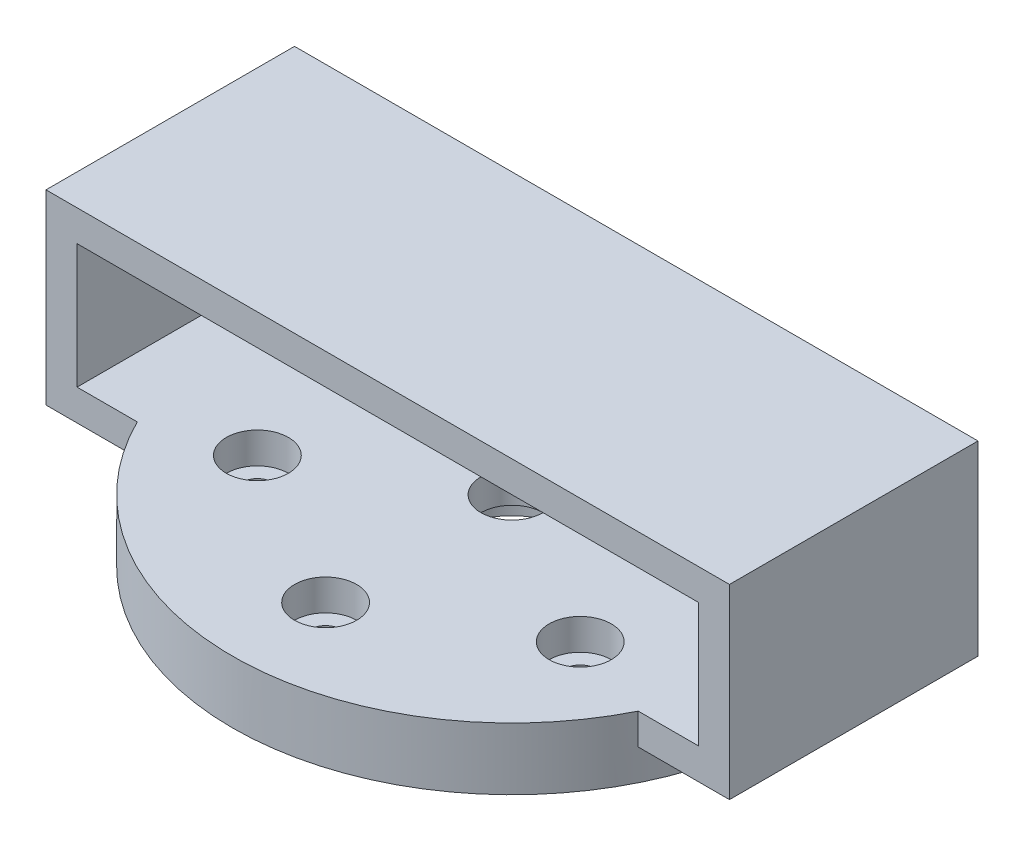
ISO-10303-21;
HEADER;
FILE_DESCRIPTION(('STEP AP214'),'2;1');
FILE_NAME('part.step','',(''),(''),'','','');
FILE_SCHEMA(('AUTOMOTIVE_DESIGN { 1 0 10303 214 1 1 1 1 }'));
ENDSEC;
DATA;
#1=APPLICATION_CONTEXT('core data for automotive mechanical design processes');
#2=APPLICATION_PROTOCOL_DEFINITION('international standard','automotive_design',2000,#1);
#3=PRODUCT_CONTEXT('',#1,'mechanical');
#4=PRODUCT('Part','Part','',(#3));
#5=PRODUCT_RELATED_PRODUCT_CATEGORY('part','',(#4));
#6=PRODUCT_DEFINITION_FORMATION('','',#4);
#7=PRODUCT_DEFINITION_CONTEXT('part definition',#1,'design');
#8=PRODUCT_DEFINITION('design','',#6,#7);
#9=PRODUCT_DEFINITION_SHAPE('','',#8);
#10=(LENGTH_UNIT() NAMED_UNIT(*) SI_UNIT(.MILLI.,.METRE.));
#11=(NAMED_UNIT(*) PLANE_ANGLE_UNIT() SI_UNIT($,.RADIAN.));
#12=(NAMED_UNIT(*) SI_UNIT($,.STERADIAN.) SOLID_ANGLE_UNIT());
#13=UNCERTAINTY_MEASURE_WITH_UNIT(LENGTH_MEASURE(1.E-05),#10,'distance_accuracy_value','');
#14=(GEOMETRIC_REPRESENTATION_CONTEXT(3) GLOBAL_UNCERTAINTY_ASSIGNED_CONTEXT((#13)) GLOBAL_UNIT_ASSIGNED_CONTEXT((#10,
#11,#12)) REPRESENTATION_CONTEXT('',''));
#15=CARTESIAN_POINT('',(0.,0.,0.));
#16=DIRECTION('',(0.,0.,1.));
#17=DIRECTION('',(1.,0.,0.));
#18=AXIS2_PLACEMENT_3D('',#15,#16,#17);
#19=CARTESIAN_POINT('',(0.,10.,-30.));
#20=DIRECTION('',(0.,-1.,0.));
#21=DIRECTION('',(0.,0.,-1.));
#22=AXIS2_PLACEMENT_3D('',#19,#20,#21);
#23=CYLINDRICAL_SURFACE('',#22,2.5);
#24=CARTESIAN_POINT('',(0.,0.,-30.));
#25=DIRECTION('',(0.,1.,0.));
#26=DIRECTION('',(0.,0.,1.));
#27=AXIS2_PLACEMENT_3D('',#24,#25,#26);
#28=CIRCLE('',#27,2.5);
#29=CARTESIAN_POINT('',(0.,0.,-27.5));
#30=VERTEX_POINT('',#29);
#31=EDGE_CURVE('E222',#30,#30,#28,.T.);
#32=ORIENTED_EDGE('',*,*,#31,.F.);
#33=EDGE_LOOP('',(#32));
#34=FACE_BOUND('',#33,.T.);
#35=CARTESIAN_POINT('',(0.,5.,-30.));
#36=DIRECTION('',(0.,1.,0.));
#37=DIRECTION('',(0.,0.,1.));
#38=AXIS2_PLACEMENT_3D('',#35,#36,#37);
#39=CIRCLE('',#38,2.5);
#40=CARTESIAN_POINT('',(0.,5.,-27.5));
#41=VERTEX_POINT('',#40);
#42=EDGE_CURVE('E36',#41,#41,#39,.T.);
#43=ORIENTED_EDGE('',*,*,#42,.T.);
#44=EDGE_LOOP('',(#43));
#45=FACE_BOUND('',#44,.T.);
#46=ADVANCED_FACE('F32',(#34,#45),#23,.F.);
#47=CARTESIAN_POINT('',(3.39958331045615E-12,10.,30.));
#48=DIRECTION('',(0.,-1.,0.));
#49=DIRECTION('',(0.,0.,-1.));
#50=AXIS2_PLACEMENT_3D('',#47,#48,#49);
#51=CYLINDRICAL_SURFACE('',#50,2.50000000000345);
#52=CARTESIAN_POINT('',(3.39958331045615E-12,0.,30.));
#53=DIRECTION('',(0.,1.,0.));
#54=DIRECTION('',(0.,0.,1.));
#55=AXIS2_PLACEMENT_3D('',#52,#53,#54);
#56=CIRCLE('',#55,2.50000000000345);
#57=CARTESIAN_POINT('',(3.39958331045615E-12,0.,32.5000000000035));
#58=VERTEX_POINT('',#57);
#59=EDGE_CURVE('E213',#58,#58,#56,.T.);
#60=ORIENTED_EDGE('',*,*,#59,.F.);
#61=EDGE_LOOP('',(#60));
#62=FACE_BOUND('',#61,.T.);
#63=CARTESIAN_POINT('',(3.39958331045615E-12,5.,30.));
#64=DIRECTION('',(0.,1.,0.));
#65=DIRECTION('',(0.,0.,1.));
#66=AXIS2_PLACEMENT_3D('',#63,#64,#65);
#67=CIRCLE('',#66,2.50000000000345);
#68=CARTESIAN_POINT('',(3.39958331045615E-12,5.,32.5000000000035));
#69=VERTEX_POINT('',#68);
#70=EDGE_CURVE('E248',#69,#69,#67,.T.);
#71=ORIENTED_EDGE('',*,*,#70,.T.);
#72=EDGE_LOOP('',(#71));
#73=FACE_BOUND('',#72,.T.);
#74=ADVANCED_FACE('F317',(#62,#73),#51,.F.);
#75=CARTESIAN_POINT('',(0.,10.,0.));
#76=DIRECTION('',(0.,-1.,0.));
#77=DIRECTION('',(0.,0.,-1.));
#78=AXIS2_PLACEMENT_3D('',#75,#76,#77);
#79=CYLINDRICAL_SURFACE('',#78,10.);
#80=CARTESIAN_POINT('',(0.,0.,0.));
#81=DIRECTION('',(0.,1.,0.));
#82=DIRECTION('',(0.,0.,1.));
#83=AXIS2_PLACEMENT_3D('',#80,#81,#82);
#84=CIRCLE('',#83,10.);
#85=CARTESIAN_POINT('',(0.,0.,10.));
#86=VERTEX_POINT('',#85);
#87=EDGE_CURVE('E225',#86,#86,#84,.T.);
#88=ORIENTED_EDGE('',*,*,#87,.F.);
#89=EDGE_LOOP('',(#88));
#90=FACE_BOUND('',#89,.T.);
#91=CARTESIAN_POINT('',(0.,5.,0.));
#92=DIRECTION('',(0.,1.,0.));
#93=DIRECTION('',(0.,0.,1.));
#94=AXIS2_PLACEMENT_3D('',#91,#92,#93);
#95=CIRCLE('',#94,10.);
#96=CARTESIAN_POINT('',(0.,5.,10.));
#97=VERTEX_POINT('',#96);
#98=EDGE_CURVE('E187',#97,#97,#95,.T.);
#99=ORIENTED_EDGE('',*,*,#98,.T.);
#100=EDGE_LOOP('',(#99));
#101=FACE_BOUND('',#100,.T.);
#102=ADVANCED_FACE('F323',(#90,#101),#79,.F.);
#103=CARTESIAN_POINT('',(25.980762113534,10.,-15.0000000000015));
#104=DIRECTION('',(0.,-1.,0.));
#105=DIRECTION('',(0.,0.,-1.));
#106=AXIS2_PLACEMENT_3D('',#103,#104,#105);
#107=CYLINDRICAL_SURFACE('',#106,2.50000000000046);
#108=CARTESIAN_POINT('',(25.980762113534,0.,-15.0000000000015));
#109=DIRECTION('',(0.,1.,0.));
#110=DIRECTION('',(0.,0.,1.));
#111=AXIS2_PLACEMENT_3D('',#108,#109,#110);
#112=CIRCLE('',#111,2.50000000000046);
#113=CARTESIAN_POINT('',(25.980762113534,0.,-12.500000000001));
#114=VERTEX_POINT('',#113);
#115=EDGE_CURVE('E219',#114,#114,#112,.T.);
#116=ORIENTED_EDGE('',*,*,#115,.F.);
#117=EDGE_LOOP('',(#116));
#118=FACE_BOUND('',#117,.T.);
#119=CARTESIAN_POINT('',(25.980762113534,5.,-15.0000000000015));
#120=DIRECTION('',(0.,1.,0.));
#121=DIRECTION('',(0.,0.,1.));
#122=AXIS2_PLACEMENT_3D('',#119,#120,#121);
#123=CIRCLE('',#122,2.50000000000046);
#124=CARTESIAN_POINT('',(25.980762113534,5.,-12.500000000001));
#125=VERTEX_POINT('',#124);
#126=EDGE_CURVE('E199',#125,#125,#123,.T.);
#127=ORIENTED_EDGE('',*,*,#126,.T.);
#128=EDGE_LOOP('',(#127));
#129=FACE_BOUND('',#128,.T.);
#130=ADVANCED_FACE('F329',(#118,#129),#107,.F.);
#131=CARTESIAN_POINT('',(25.9807621135357,10.,14.9999999999985));
#132=DIRECTION('',(0.,-1.,0.));
#133=DIRECTION('',(0.,0.,-1.));
#134=AXIS2_PLACEMENT_3D('',#131,#132,#133);
#135=CYLINDRICAL_SURFACE('',#134,2.50000000000215);
#136=CARTESIAN_POINT('',(25.9807621135357,0.,14.9999999999985));
#137=DIRECTION('',(0.,1.,0.));
#138=DIRECTION('',(0.,0.,1.));
#139=AXIS2_PLACEMENT_3D('',#136,#137,#138);
#140=CIRCLE('',#139,2.50000000000215);
#141=CARTESIAN_POINT('',(25.9807621135357,0.,17.5000000000007));
#142=VERTEX_POINT('',#141);
#143=EDGE_CURVE('E216',#142,#142,#140,.T.);
#144=ORIENTED_EDGE('',*,*,#143,.F.);
#145=EDGE_LOOP('',(#144));
#146=FACE_BOUND('',#145,.T.);
#147=CARTESIAN_POINT('',(25.9807621135357,5.,14.9999999999985));
#148=DIRECTION('',(0.,1.,0.));
#149=DIRECTION('',(0.,0.,1.));
#150=AXIS2_PLACEMENT_3D('',#147,#148,#149);
#151=CIRCLE('',#150,2.50000000000215);
#152=CARTESIAN_POINT('',(25.9807621135357,5.,17.5000000000007));
#153=VERTEX_POINT('',#152);
#154=EDGE_CURVE('E196',#153,#153,#151,.T.);
#155=ORIENTED_EDGE('',*,*,#154,.T.);
#156=EDGE_LOOP('',(#155));
#157=FACE_BOUND('',#156,.T.);
#158=ADVANCED_FACE('F336',(#146,#157),#135,.F.);
#159=CARTESIAN_POINT('',(-25.9807621135306,10.,15.0000000000015));
#160=DIRECTION('',(0.,-1.,0.));
#161=DIRECTION('',(0.,0.,-1.));
#162=AXIS2_PLACEMENT_3D('',#159,#160,#161);
#163=CYLINDRICAL_SURFACE('',#162,2.50000000000315);
#164=CARTESIAN_POINT('',(-25.9807621135306,0.,15.0000000000015));
#165=DIRECTION('',(0.,1.,0.));
#166=DIRECTION('',(0.,0.,1.));
#167=AXIS2_PLACEMENT_3D('',#164,#165,#166);
#168=CIRCLE('',#167,2.50000000000315);
#169=CARTESIAN_POINT('',(-25.9807621135306,0.,17.5000000000046));
#170=VERTEX_POINT('',#169);
#171=EDGE_CURVE('E210',#170,#170,#168,.T.);
#172=ORIENTED_EDGE('',*,*,#171,.F.);
#173=EDGE_LOOP('',(#172));
#174=FACE_BOUND('',#173,.T.);
#175=CARTESIAN_POINT('',(-25.9807621135306,5.,15.0000000000015));
#176=DIRECTION('',(0.,1.,0.));
#177=DIRECTION('',(0.,0.,1.));
#178=AXIS2_PLACEMENT_3D('',#175,#176,#177);
#179=CIRCLE('',#178,2.50000000000315);
#180=CARTESIAN_POINT('',(-25.9807621135306,5.,17.5000000000046));
#181=VERTEX_POINT('',#180);
#182=EDGE_CURVE('E193',#181,#181,#179,.T.);
#183=ORIENTED_EDGE('',*,*,#182,.T.);
#184=EDGE_LOOP('',(#183));
#185=FACE_BOUND('',#184,.T.);
#186=ADVANCED_FACE('F310',(#174,#185),#163,.F.);
#187=CARTESIAN_POINT('',(-25.9807621135323,10.,-14.9999999999985));
#188=DIRECTION('',(0.,-1.,0.));
#189=DIRECTION('',(0.,0.,-1.));
#190=AXIS2_PLACEMENT_3D('',#187,#188,#189);
#191=CYLINDRICAL_SURFACE('',#190,2.5000000000016);
#192=CARTESIAN_POINT('',(-25.9807621135323,0.,-14.9999999999985));
#193=DIRECTION('',(0.,1.,0.));
#194=DIRECTION('',(0.,0.,1.));
#195=AXIS2_PLACEMENT_3D('',#192,#193,#194);
#196=CIRCLE('',#195,2.5000000000016);
#197=CARTESIAN_POINT('',(-25.9807621135323,0.,-12.4999999999969));
#198=VERTEX_POINT('',#197);
#199=EDGE_CURVE('E207',#198,#198,#196,.T.);
#200=ORIENTED_EDGE('',*,*,#199,.F.);
#201=EDGE_LOOP('',(#200));
#202=FACE_BOUND('',#201,.T.);
#203=CARTESIAN_POINT('',(-25.9807621135323,5.,-14.9999999999985));
#204=DIRECTION('',(0.,1.,0.));
#205=DIRECTION('',(0.,0.,1.));
#206=AXIS2_PLACEMENT_3D('',#203,#204,#205);
#207=CIRCLE('',#206,2.5000000000016);
#208=CARTESIAN_POINT('',(-25.9807621135323,5.,-12.4999999999969));
#209=VERTEX_POINT('',#208);
#210=EDGE_CURVE('E143',#209,#209,#207,.T.);
#211=ORIENTED_EDGE('',*,*,#210,.T.);
#212=EDGE_LOOP('',(#211));
#213=FACE_BOUND('',#212,.T.);
#214=ADVANCED_FACE('F302',(#202,#213),#191,.F.);
#215=CARTESIAN_POINT('',(0.,10.,0.));
#216=DIRECTION('',(0.,1.,0.));
#217=DIRECTION('',(0.,0.,1.));
#218=AXIS2_PLACEMENT_3D('',#215,#216,#217);
#219=PLANE('',#218);
#220=CARTESIAN_POINT('',(0.,10.,-30.));
#221=DIRECTION('',(0.,1.,0.));
#222=DIRECTION('',(0.,0.,1.));
#223=AXIS2_PLACEMENT_3D('',#220,#221,#222);
#224=CIRCLE('',#223,5.);
#225=CARTESIAN_POINT('',(0.,10.,-25.));
#226=VERTEX_POINT('',#225);
#227=EDGE_CURVE('E255',#226,#226,#224,.T.);
#228=ORIENTED_EDGE('',*,*,#227,.F.);
#229=EDGE_LOOP('',(#228));
#230=FACE_BOUND('',#229,.T.);
#231=CARTESIAN_POINT('',(1.69794191727524E-12,10.,0.));
#232=DIRECTION('',(0.,1.,0.));
#233=DIRECTION('',(0.,0.,1.));
#234=AXIS2_PLACEMENT_3D('',#231,#232,#233);
#235=CIRCLE('',#234,5.);
#236=CARTESIAN_POINT('',(1.69794191727524E-12,10.,5.));
#237=VERTEX_POINT('',#236);
#238=EDGE_CURVE('E265',#237,#237,#235,.T.);
#239=ORIENTED_EDGE('',*,*,#238,.F.);
#240=EDGE_LOOP('',(#239));
#241=FACE_BOUND('',#240,.T.);
#242=CARTESIAN_POINT('',(25.980762113534,10.,-15.0000000000015));
#243=DIRECTION('',(0.,1.,0.));
#244=DIRECTION('',(0.,0.,1.));
#245=AXIS2_PLACEMENT_3D('',#242,#243,#244);
#246=CIRCLE('',#245,5.00000000000046);
#247=CARTESIAN_POINT('',(25.980762113534,10.,-10.000000000001));
#248=VERTEX_POINT('',#247);
#249=EDGE_CURVE('E271',#248,#248,#246,.T.);
#250=ORIENTED_EDGE('',*,*,#249,.F.);
#251=EDGE_LOOP('',(#250));
#252=FACE_BOUND('',#251,.T.);
#253=CARTESIAN_POINT('',(25.9807621135357,10.,14.9999999999985));
#254=DIRECTION('',(0.,1.,0.));
#255=DIRECTION('',(0.,0.,1.));
#256=AXIS2_PLACEMENT_3D('',#253,#254,#255);
#257=CIRCLE('',#256,5.00000000000214);
#258=CARTESIAN_POINT('',(25.9807621135357,10.,20.0000000000007));
#259=VERTEX_POINT('',#258);
#260=EDGE_CURVE('E277',#259,#259,#257,.T.);
#261=ORIENTED_EDGE('',*,*,#260,.F.);
#262=EDGE_LOOP('',(#261));
#263=FACE_BOUND('',#262,.T.);
#264=CARTESIAN_POINT('',(3.39958331045615E-12,10.,30.));
#265=DIRECTION('',(0.,1.,0.));
#266=DIRECTION('',(0.,0.,1.));
#267=AXIS2_PLACEMENT_3D('',#264,#265,#266);
#268=CIRCLE('',#267,5.00000000000345);
#269=CARTESIAN_POINT('',(3.39958331045615E-12,10.,35.0000000000034));
#270=VERTEX_POINT('',#269);
#271=EDGE_CURVE('E283',#270,#270,#268,.T.);
#272=ORIENTED_EDGE('',*,*,#271,.F.);
#273=EDGE_LOOP('',(#272));
#274=FACE_BOUND('',#273,.T.);
#275=CARTESIAN_POINT('',(-25.9807621135306,10.,15.0000000000015));
#276=DIRECTION('',(0.,1.,0.));
#277=DIRECTION('',(0.,0.,1.));
#278=AXIS2_PLACEMENT_3D('',#275,#276,#277);
#279=CIRCLE('',#278,5.00000000000315);
#280=CARTESIAN_POINT('',(-25.9807621135306,10.,20.0000000000046));
#281=VERTEX_POINT('',#280);
#282=EDGE_CURVE('E289',#281,#281,#279,.T.);
#283=ORIENTED_EDGE('',*,*,#282,.F.);
#284=EDGE_LOOP('',(#283));
#285=FACE_BOUND('',#284,.T.);
#286=CARTESIAN_POINT('',(-25.9807621135323,10.,-14.9999999999985));
#287=DIRECTION('',(0.,1.,0.));
#288=DIRECTION('',(0.,0.,1.));
#289=AXIS2_PLACEMENT_3D('',#286,#287,#288);
#290=CIRCLE('',#289,5.0000000000016);
#291=CARTESIAN_POINT('',(-25.9807621135323,10.,-9.99999999999691));
#292=VERTEX_POINT('',#291);
#293=EDGE_CURVE('E294',#292,#292,#290,.T.);
#294=ORIENTED_EDGE('',*,*,#293,.F.);
#295=EDGE_LOOP('',(#294));
#296=FACE_BOUND('',#295,.T.);
#297=CARTESIAN_POINT('',(0.,10.,0.));
#298=DIRECTION('',(0.,1.,0.));
#299=DIRECTION('',(0.,0.,1.));
#300=AXIS2_PLACEMENT_3D('',#297,#298,#299);
#301=CIRCLE('',#300,45.);
#302=CARTESIAN_POINT('',(-40.3112887414927,10.,20.));
#303=VERTEX_POINT('',#302);
#304=CARTESIAN_POINT('',(40.3112887414927,10.,20.));
#305=VERTEX_POINT('',#304);
#306=EDGE_CURVE('E229',#303,#305,#301,.T.);
#307=ORIENTED_EDGE('',*,*,#306,.T.);
#308=DIRECTION('',(1.,0.,0.));
#309=VECTOR('',#308,1.);
#310=CARTESIAN_POINT('',(-55.,10.,20.));
#311=LINE('',#310,#309);
#312=CARTESIAN_POINT('',(50.,10.,20.));
#313=VERTEX_POINT('',#312);
#314=EDGE_CURVE('E43',#305,#313,#311,.T.);
#315=ORIENTED_EDGE('',*,*,#314,.T.);
#316=DIRECTION('',(0.,0.,-1.));
#317=VECTOR('',#316,1.);
#318=CARTESIAN_POINT('',(50.,10.,25.));
#319=LINE('',#318,#317);
#320=CARTESIAN_POINT('',(50.,10.,-20.));
#321=VERTEX_POINT('',#320);
#322=EDGE_CURVE('E122',#313,#321,#319,.T.);
#323=ORIENTED_EDGE('',*,*,#322,.T.);
#324=DIRECTION('',(-1.,0.,0.));
#325=VECTOR('',#324,1.);
#326=CARTESIAN_POINT('',(50.,10.,-20.));
#327=LINE('',#326,#325);
#328=CARTESIAN_POINT('',(40.3112887414927,10.,-20.));
#329=VERTEX_POINT('',#328);
#330=EDGE_CURVE('E127',#321,#329,#327,.T.);
#331=ORIENTED_EDGE('',*,*,#330,.T.);
#332=CARTESIAN_POINT('',(-40.3112887414927,10.,-20.));
#333=VERTEX_POINT('',#332);
#334=EDGE_CURVE('E231',#329,#333,#301,.T.);
#335=ORIENTED_EDGE('',*,*,#334,.T.);
#336=CARTESIAN_POINT('',(-50.,10.,-20.));
#337=VERTEX_POINT('',#336);
#338=EDGE_CURVE('E142',#333,#337,#327,.T.);
#339=ORIENTED_EDGE('',*,*,#338,.T.);
#340=DIRECTION('',(0.,0.,-1.));
#341=VECTOR('',#340,1.);
#342=CARTESIAN_POINT('',(-50.,10.,25.));
#343=LINE('',#342,#341);
#344=CARTESIAN_POINT('',(-50.,10.,20.));
#345=VERTEX_POINT('',#344);
#346=EDGE_CURVE('E131',#345,#337,#343,.T.);
#347=ORIENTED_EDGE('',*,*,#346,.F.);
#348=EDGE_CURVE('E11',#345,#303,#311,.T.);
#349=ORIENTED_EDGE('',*,*,#348,.T.);
#350=EDGE_LOOP('',(#307,#315,#323,#331,#335,#339,#347,#349));
#351=FACE_BOUND('',#350,.T.);
#352=ADVANCED_FACE('F124',(#230,#241,#252,#263,#274,#285,#296,#351),#219,.T.);
#353=CARTESIAN_POINT('',(0.,0.,0.));
#354=DIRECTION('',(0.,1.,0.));
#355=DIRECTION('',(0.,0.,1.));
#356=AXIS2_PLACEMENT_3D('',#353,#354,#355);
#357=PLANE('',#356);
#358=CARTESIAN_POINT('',(0.,0.,0.));
#359=DIRECTION('',(0.,1.,0.));
#360=DIRECTION('',(0.,0.,1.));
#361=AXIS2_PLACEMENT_3D('',#358,#359,#360);
#362=CIRCLE('',#361,45.);
#363=CARTESIAN_POINT('',(0.,0.,45.));
#364=VERTEX_POINT('',#363);
#365=EDGE_CURVE('E228',#364,#364,#362,.T.);
#366=ORIENTED_EDGE('',*,*,#365,.F.);
#367=EDGE_LOOP('',(#366));
#368=FACE_BOUND('',#367,.T.);
#369=ORIENTED_EDGE('',*,*,#87,.T.);
#370=EDGE_LOOP('',(#369));
#371=FACE_BOUND('',#370,.T.);
#372=ORIENTED_EDGE('',*,*,#31,.T.);
#373=EDGE_LOOP('',(#372));
#374=FACE_BOUND('',#373,.T.);
#375=ORIENTED_EDGE('',*,*,#115,.T.);
#376=EDGE_LOOP('',(#375));
#377=FACE_BOUND('',#376,.T.);
#378=ORIENTED_EDGE('',*,*,#143,.T.);
#379=EDGE_LOOP('',(#378));
#380=FACE_BOUND('',#379,.T.);
#381=ORIENTED_EDGE('',*,*,#59,.T.);
#382=EDGE_LOOP('',(#381));
#383=FACE_BOUND('',#382,.T.);
#384=ORIENTED_EDGE('',*,*,#171,.T.);
#385=EDGE_LOOP('',(#384));
#386=FACE_BOUND('',#385,.T.);
#387=ORIENTED_EDGE('',*,*,#199,.T.);
#388=EDGE_LOOP('',(#387));
#389=FACE_BOUND('',#388,.T.);
#390=ADVANCED_FACE('F301',(#368,#371,#374,#377,#380,#383,#386,#389),#357,.F.);
#391=CARTESIAN_POINT('',(0.,10.,0.));
#392=DIRECTION('',(0.,-1.,0.));
#393=DIRECTION('',(0.,0.,-1.));
#394=AXIS2_PLACEMENT_3D('',#391,#392,#393);
#395=CYLINDRICAL_SURFACE('',#394,45.);
#396=ORIENTED_EDGE('',*,*,#334,.F.);
#397=DIRECTION('',(0.,-1.,0.));
#398=VECTOR('',#397,1.);
#399=CARTESIAN_POINT('',(40.3112887414927,10.,-20.));
#400=LINE('',#399,#398);
#401=CARTESIAN_POINT('',(40.3112887414927,5.,-20.));
#402=VERTEX_POINT('',#401);
#403=EDGE_CURVE('E50',#329,#402,#400,.T.);
#404=ORIENTED_EDGE('',*,*,#403,.T.);
#405=CARTESIAN_POINT('',(0.,5.,0.));
#406=DIRECTION('',(0.,1.,0.));
#407=DIRECTION('',(0.,0.,1.));
#408=AXIS2_PLACEMENT_3D('',#405,#406,#407);
#409=CIRCLE('',#408,45.);
#410=CARTESIAN_POINT('',(40.3112887414927,5.,20.));
#411=VERTEX_POINT('',#410);
#412=EDGE_CURVE('E54',#411,#402,#409,.T.);
#413=ORIENTED_EDGE('',*,*,#412,.F.);
#414=DIRECTION('',(0.,-1.,0.));
#415=VECTOR('',#414,1.);
#416=CARTESIAN_POINT('',(40.3112887414927,10.,20.));
#417=LINE('',#416,#415);
#418=EDGE_CURVE('E241',#411,#305,#417,.F.);
#419=ORIENTED_EDGE('',*,*,#418,.T.);
#420=ORIENTED_EDGE('',*,*,#306,.F.);
#421=DIRECTION('',(0.,-1.,0.));
#422=VECTOR('',#421,1.);
#423=CARTESIAN_POINT('',(-40.3112887414927,10.,20.));
#424=LINE('',#423,#422);
#425=CARTESIAN_POINT('',(-40.3112887414927,5.,20.));
#426=VERTEX_POINT('',#425);
#427=EDGE_CURVE('E236',#303,#426,#424,.T.);
#428=ORIENTED_EDGE('',*,*,#427,.T.);
#429=CARTESIAN_POINT('',(-40.3112887414927,5.,-20.));
#430=VERTEX_POINT('',#429);
#431=EDGE_CURVE('E204',#430,#426,#409,.T.);
#432=ORIENTED_EDGE('',*,*,#431,.F.);
#433=DIRECTION('',(0.,-1.,0.));
#434=VECTOR('',#433,1.);
#435=CARTESIAN_POINT('',(-40.3112887414927,10.,-20.));
#436=LINE('',#435,#434);
#437=EDGE_CURVE('E238',#430,#333,#436,.F.);
#438=ORIENTED_EDGE('',*,*,#437,.T.);
#439=EDGE_LOOP('',(#396,#404,#413,#419,#420,#428,#432,#438));
#440=FACE_BOUND('',#439,.T.);
#441=ORIENTED_EDGE('',*,*,#365,.T.);
#442=EDGE_LOOP('',(#441));
#443=FACE_BOUND('',#442,.T.);
#444=ADVANCED_FACE('F34',(#440,#443),#395,.T.);
#445=CARTESIAN_POINT('',(0.,5.,0.));
#446=DIRECTION('',(0.,1.,0.));
#447=DIRECTION('',(0.,0.,1.));
#448=AXIS2_PLACEMENT_3D('',#445,#446,#447);
#449=PLANE('',#448);
#450=CARTESIAN_POINT('',(1.69794191727524E-12,5.,0.));
#451=DIRECTION('',(0.,1.,0.));
#452=DIRECTION('',(0.,0.,1.));
#453=AXIS2_PLACEMENT_3D('',#450,#451,#452);
#454=CIRCLE('',#453,5.);
#455=CARTESIAN_POINT('',(1.69794191727524E-12,5.,5.));
#456=VERTEX_POINT('',#455);
#457=EDGE_CURVE('E260',#456,#456,#454,.T.);
#458=ORIENTED_EDGE('',*,*,#457,.T.);
#459=EDGE_LOOP('',(#458));
#460=FACE_BOUND('',#459,.T.);
#461=ORIENTED_EDGE('',*,*,#98,.F.);
#462=EDGE_LOOP('',(#461));
#463=FACE_BOUND('',#462,.T.);
#464=ADVANCED_FACE('F342',(#460,#463),#449,.F.);
#465=CARTESIAN_POINT('',(-55.,5.,-20.));
#466=DIRECTION('',(0.,0.,-1.));
#467=DIRECTION('',(-1.,0.,0.));
#468=AXIS2_PLACEMENT_3D('',#465,#466,#467);
#469=PLANE('',#468);
#470=ORIENTED_EDGE('',*,*,#330,.F.);
#471=DIRECTION('',(0.,-1.,0.));
#472=VECTOR('',#471,1.);
#473=CARTESIAN_POINT('',(50.,30.,-20.));
#474=LINE('',#473,#472);
#475=CARTESIAN_POINT('',(50.,30.,-20.));
#476=VERTEX_POINT('',#475);
#477=EDGE_CURVE('E135',#476,#321,#474,.T.);
#478=ORIENTED_EDGE('',*,*,#477,.F.);
#479=DIRECTION('',(1.,0.,0.));
#480=VECTOR('',#479,1.);
#481=CARTESIAN_POINT('',(50.,30.,-20.));
#482=LINE('',#481,#480);
#483=CARTESIAN_POINT('',(-50.,30.,-20.));
#484=VERTEX_POINT('',#483);
#485=EDGE_CURVE('E132',#484,#476,#482,.T.);
#486=ORIENTED_EDGE('',*,*,#485,.F.);
#487=DIRECTION('',(0.,1.,0.));
#488=VECTOR('',#487,1.);
#489=CARTESIAN_POINT('',(-50.,30.,-20.));
#490=LINE('',#489,#488);
#491=EDGE_CURVE('E147',#337,#484,#490,.T.);
#492=ORIENTED_EDGE('',*,*,#491,.F.);
#493=ORIENTED_EDGE('',*,*,#338,.F.);
#494=ORIENTED_EDGE('',*,*,#437,.F.);
#495=DIRECTION('',(-1.,0.,0.));
#496=VECTOR('',#495,1.);
#497=CARTESIAN_POINT('',(-55.,5.,-20.));
#498=LINE('',#497,#496);
#499=CARTESIAN_POINT('',(-55.,5.,-20.));
#500=VERTEX_POINT('',#499);
#501=EDGE_CURVE('E181',#430,#500,#498,.T.);
#502=ORIENTED_EDGE('',*,*,#501,.T.);
#503=DIRECTION('',(0.,1.,0.));
#504=VECTOR('',#503,1.);
#505=CARTESIAN_POINT('',(-55.,5.,-20.));
#506=LINE('',#505,#504);
#507=CARTESIAN_POINT('',(-55.,35.,-20.));
#508=VERTEX_POINT('',#507);
#509=EDGE_CURVE('E185',#500,#508,#506,.T.);
#510=ORIENTED_EDGE('',*,*,#509,.T.);
#511=DIRECTION('',(-1.,0.,0.));
#512=VECTOR('',#511,1.);
#513=CARTESIAN_POINT('',(-55.,35.,-20.));
#514=LINE('',#513,#512);
#515=CARTESIAN_POINT('',(55.,35.,-20.));
#516=VERTEX_POINT('',#515);
#517=EDGE_CURVE('E168',#516,#508,#514,.T.);
#518=ORIENTED_EDGE('',*,*,#517,.F.);
#519=DIRECTION('',(0.,1.,0.));
#520=VECTOR('',#519,1.);
#521=CARTESIAN_POINT('',(55.,5.,-20.));
#522=LINE('',#521,#520);
#523=CARTESIAN_POINT('',(55.,5.,-20.));
#524=VERTEX_POINT('',#523);
#525=EDGE_CURVE('E188',#524,#516,#522,.T.);
#526=ORIENTED_EDGE('',*,*,#525,.F.);
#527=EDGE_CURVE('E182',#524,#402,#498,.T.);
#528=ORIENTED_EDGE('',*,*,#527,.T.);
#529=ORIENTED_EDGE('',*,*,#403,.F.);
#530=EDGE_LOOP('',(#470,#478,#486,#492,#493,#494,#502,#510,#518,#526,#528,#529));
#531=FACE_BOUND('',#530,.T.);
#532=ADVANCED_FACE('F145',(#531),#469,.T.);
#533=CARTESIAN_POINT('',(-55.,5.,20.));
#534=DIRECTION('',(0.,0.,1.));
#535=DIRECTION('',(1.,0.,0.));
#536=AXIS2_PLACEMENT_3D('',#533,#534,#535);
#537=PLANE('',#536);
#538=ORIENTED_EDGE('',*,*,#348,.F.);
#539=DIRECTION('',(0.,-1.,0.));
#540=VECTOR('',#539,1.);
#541=CARTESIAN_POINT('',(-50.,5.,20.));
#542=LINE('',#541,#540);
#543=CARTESIAN_POINT('',(-50.,30.,20.));
#544=VERTEX_POINT('',#543);
#545=EDGE_CURVE('E41',#544,#345,#542,.T.);
#546=ORIENTED_EDGE('',*,*,#545,.F.);
#547=DIRECTION('',(-1.,0.,0.));
#548=VECTOR('',#547,1.);
#549=CARTESIAN_POINT('',(-55.,30.,20.));
#550=LINE('',#549,#548);
#551=CARTESIAN_POINT('',(50.,30.,20.));
#552=VERTEX_POINT('',#551);
#553=EDGE_CURVE('E246',#552,#544,#550,.T.);
#554=ORIENTED_EDGE('',*,*,#553,.F.);
#555=DIRECTION('',(0.,1.,0.));
#556=VECTOR('',#555,1.);
#557=CARTESIAN_POINT('',(50.,5.,20.));
#558=LINE('',#557,#556);
#559=EDGE_CURVE('E244',#313,#552,#558,.T.);
#560=ORIENTED_EDGE('',*,*,#559,.F.);
#561=ORIENTED_EDGE('',*,*,#314,.F.);
#562=ORIENTED_EDGE('',*,*,#418,.F.);
#563=DIRECTION('',(1.,0.,0.));
#564=VECTOR('',#563,1.);
#565=CARTESIAN_POINT('',(-55.,5.,20.));
#566=LINE('',#565,#564);
#567=CARTESIAN_POINT('',(55.,5.,20.));
#568=VERTEX_POINT('',#567);
#569=EDGE_CURVE('E174',#411,#568,#566,.T.);
#570=ORIENTED_EDGE('',*,*,#569,.T.);
#571=DIRECTION('',(0.,1.,0.));
#572=VECTOR('',#571,1.);
#573=CARTESIAN_POINT('',(55.,5.,20.));
#574=LINE('',#573,#572);
#575=CARTESIAN_POINT('',(55.,35.,20.));
#576=VERTEX_POINT('',#575);
#577=EDGE_CURVE('E190',#568,#576,#574,.T.);
#578=ORIENTED_EDGE('',*,*,#577,.T.);
#579=DIRECTION('',(1.,0.,0.));
#580=VECTOR('',#579,1.);
#581=CARTESIAN_POINT('',(-55.,35.,20.));
#582=LINE('',#581,#580);
#583=CARTESIAN_POINT('',(-55.,35.,20.));
#584=VERTEX_POINT('',#583);
#585=EDGE_CURVE('E162',#584,#576,#582,.T.);
#586=ORIENTED_EDGE('',*,*,#585,.F.);
#587=DIRECTION('',(0.,1.,0.));
#588=VECTOR('',#587,1.);
#589=CARTESIAN_POINT('',(-55.,5.,20.));
#590=LINE('',#589,#588);
#591=CARTESIAN_POINT('',(-55.,5.,20.));
#592=VERTEX_POINT('',#591);
#593=EDGE_CURVE('E184',#592,#584,#590,.T.);
#594=ORIENTED_EDGE('',*,*,#593,.F.);
#595=EDGE_CURVE('E175',#592,#426,#566,.T.);
#596=ORIENTED_EDGE('',*,*,#595,.T.);
#597=ORIENTED_EDGE('',*,*,#427,.F.);
#598=EDGE_LOOP('',(#538,#546,#554,#560,#561,#562,#570,#578,#586,#594,#596,#597));
#599=FACE_BOUND('',#598,.T.);
#600=ADVANCED_FACE('F352',(#599),#537,.T.);
#601=ORIENTED_EDGE('',*,*,#569,.F.);
#602=ORIENTED_EDGE('',*,*,#412,.T.);
#603=ORIENTED_EDGE('',*,*,#527,.F.);
#604=DIRECTION('',(0.,0.,-1.));
#605=VECTOR('',#604,1.);
#606=CARTESIAN_POINT('',(55.,5.,-20.));
#607=LINE('',#606,#605);
#608=EDGE_CURVE('E178',#568,#524,#607,.T.);
#609=ORIENTED_EDGE('',*,*,#608,.F.);
#610=EDGE_LOOP('',(#601,#602,#603,#609));
#611=FACE_BOUND('',#610,.T.);
#612=ADVANCED_FACE('F347',(#611),#449,.F.);
#613=CARTESIAN_POINT('',(-55.,5.,-20.));
#614=DIRECTION('',(-1.,0.,0.));
#615=DIRECTION('',(0.,0.,1.));
#616=AXIS2_PLACEMENT_3D('',#613,#614,#615);
#617=PLANE('',#616);
#618=ORIENTED_EDGE('',*,*,#593,.T.);
#619=DIRECTION('',(0.,0.,1.));
#620=VECTOR('',#619,1.);
#621=CARTESIAN_POINT('',(-55.,35.,-20.));
#622=LINE('',#621,#620);
#623=EDGE_CURVE('E156',#508,#584,#622,.T.);
#624=ORIENTED_EDGE('',*,*,#623,.F.);
#625=ORIENTED_EDGE('',*,*,#509,.F.);
#626=DIRECTION('',(0.,0.,1.));
#627=VECTOR('',#626,1.);
#628=CARTESIAN_POINT('',(-55.,5.,-20.));
#629=LINE('',#628,#627);
#630=EDGE_CURVE('E171',#500,#592,#629,.T.);
#631=ORIENTED_EDGE('',*,*,#630,.T.);
#632=EDGE_LOOP('',(#618,#624,#625,#631));
#633=FACE_BOUND('',#632,.T.);
#634=ADVANCED_FACE('F360',(#633),#617,.T.);
#635=CARTESIAN_POINT('',(55.,5.,-20.));
#636=DIRECTION('',(1.,0.,0.));
#637=DIRECTION('',(0.,0.,-1.));
#638=AXIS2_PLACEMENT_3D('',#635,#636,#637);
#639=PLANE('',#638);
#640=ORIENTED_EDGE('',*,*,#525,.T.);
#641=DIRECTION('',(0.,0.,-1.));
#642=VECTOR('',#641,1.);
#643=CARTESIAN_POINT('',(55.,35.,-20.));
#644=LINE('',#643,#642);
#645=EDGE_CURVE('E165',#576,#516,#644,.T.);
#646=ORIENTED_EDGE('',*,*,#645,.F.);
#647=ORIENTED_EDGE('',*,*,#577,.F.);
#648=ORIENTED_EDGE('',*,*,#608,.T.);
#649=EDGE_LOOP('',(#640,#646,#647,#648));
#650=FACE_BOUND('',#649,.T.);
#651=ADVANCED_FACE('F357',(#650),#639,.T.);
#652=ORIENTED_EDGE('',*,*,#501,.F.);
#653=ORIENTED_EDGE('',*,*,#431,.T.);
#654=ORIENTED_EDGE('',*,*,#595,.F.);
#655=ORIENTED_EDGE('',*,*,#630,.F.);
#656=EDGE_LOOP('',(#652,#653,#654,#655));
#657=FACE_BOUND('',#656,.T.);
#658=ADVANCED_FACE('F346',(#657),#449,.F.);
#659=CARTESIAN_POINT('',(0.,35.,0.));
#660=DIRECTION('',(0.,1.,0.));
#661=DIRECTION('',(0.,0.,1.));
#662=AXIS2_PLACEMENT_3D('',#659,#660,#661);
#663=PLANE('',#662);
#664=ORIENTED_EDGE('',*,*,#623,.T.);
#665=ORIENTED_EDGE('',*,*,#585,.T.);
#666=ORIENTED_EDGE('',*,*,#645,.T.);
#667=ORIENTED_EDGE('',*,*,#517,.T.);
#668=EDGE_LOOP('',(#664,#665,#666,#667));
#669=FACE_BOUND('',#668,.T.);
#670=ADVANCED_FACE('F356',(#669),#663,.T.);
#671=CARTESIAN_POINT('',(50.,30.,25.));
#672=DIRECTION('',(1.,0.,0.));
#673=DIRECTION('',(0.,0.,-1.));
#674=AXIS2_PLACEMENT_3D('',#671,#672,#673);
#675=PLANE('',#674);
#676=ORIENTED_EDGE('',*,*,#559,.T.);
#677=DIRECTION('',(0.,0.,-1.));
#678=VECTOR('',#677,1.);
#679=CARTESIAN_POINT('',(50.,30.,25.));
#680=LINE('',#679,#678);
#681=EDGE_CURVE('E138',#552,#476,#680,.T.);
#682=ORIENTED_EDGE('',*,*,#681,.T.);
#683=ORIENTED_EDGE('',*,*,#477,.T.);
#684=ORIENTED_EDGE('',*,*,#322,.F.);
#685=EDGE_LOOP('',(#676,#682,#683,#684));
#686=FACE_BOUND('',#685,.T.);
#687=ADVANCED_FACE('F136',(#686),#675,.F.);
#688=CARTESIAN_POINT('',(50.,30.,25.));
#689=DIRECTION('',(0.,1.,0.));
#690=DIRECTION('',(0.,0.,1.));
#691=AXIS2_PLACEMENT_3D('',#688,#689,#690);
#692=PLANE('',#691);
#693=ORIENTED_EDGE('',*,*,#553,.T.);
#694=DIRECTION('',(0.,0.,-1.));
#695=VECTOR('',#694,1.);
#696=CARTESIAN_POINT('',(-50.,30.,25.));
#697=LINE('',#696,#695);
#698=EDGE_CURVE('E157',#544,#484,#697,.T.);
#699=ORIENTED_EDGE('',*,*,#698,.T.);
#700=ORIENTED_EDGE('',*,*,#485,.T.);
#701=ORIENTED_EDGE('',*,*,#681,.F.);
#702=EDGE_LOOP('',(#693,#699,#700,#701));
#703=FACE_BOUND('',#702,.T.);
#704=ADVANCED_FACE('F393',(#703),#692,.F.);
#705=CARTESIAN_POINT('',(-50.,30.,25.));
#706=DIRECTION('',(-1.,0.,0.));
#707=DIRECTION('',(0.,0.,1.));
#708=AXIS2_PLACEMENT_3D('',#705,#706,#707);
#709=PLANE('',#708);
#710=ORIENTED_EDGE('',*,*,#545,.T.);
#711=ORIENTED_EDGE('',*,*,#346,.T.);
#712=ORIENTED_EDGE('',*,*,#491,.T.);
#713=ORIENTED_EDGE('',*,*,#698,.F.);
#714=EDGE_LOOP('',(#710,#711,#712,#713));
#715=FACE_BOUND('',#714,.T.);
#716=ADVANCED_FACE('F397',(#715),#709,.F.);
#717=CARTESIAN_POINT('',(3.39958331045615E-12,5.,30.));
#718=DIRECTION('',(0.,1.,0.));
#719=DIRECTION('',(0.,0.,1.));
#720=AXIS2_PLACEMENT_3D('',#717,#718,#719);
#721=CYLINDRICAL_SURFACE('',#720,5.00000000000345);
#722=CARTESIAN_POINT('',(3.39958331045615E-12,5.,30.));
#723=DIRECTION('',(0.,1.,0.));
#724=DIRECTION('',(0.,0.,1.));
#725=AXIS2_PLACEMENT_3D('',#722,#723,#724);
#726=CIRCLE('',#725,5.00000000000345);
#727=CARTESIAN_POINT('',(3.39958331045615E-12,5.,35.0000000000034));
#728=VERTEX_POINT('',#727);
#729=EDGE_CURVE('E280',#728,#728,#726,.T.);
#730=ORIENTED_EDGE('',*,*,#729,.F.);
#731=EDGE_LOOP('',(#730));
#732=FACE_BOUND('',#731,.T.);
#733=ORIENTED_EDGE('',*,*,#271,.T.);
#734=EDGE_LOOP('',(#733));
#735=FACE_BOUND('',#734,.T.);
#736=ADVANCED_FACE('F399',(#732,#735),#721,.F.);
#737=CARTESIAN_POINT('',(3.39958331045615E-12,5.,30.));
#738=DIRECTION('',(0.,1.,0.));
#739=DIRECTION('',(0.,0.,1.));
#740=AXIS2_PLACEMENT_3D('',#737,#738,#739);
#741=PLANE('',#740);
#742=ORIENTED_EDGE('',*,*,#70,.F.);
#743=EDGE_LOOP('',(#742));
#744=FACE_BOUND('',#743,.T.);
#745=ORIENTED_EDGE('',*,*,#729,.T.);
#746=EDGE_LOOP('',(#745));
#747=FACE_BOUND('',#746,.T.);
#748=ADVANCED_FACE('F405',(#744,#747),#741,.T.);
#749=CARTESIAN_POINT('',(0.,5.,-30.));
#750=DIRECTION('',(0.,1.,0.));
#751=DIRECTION('',(0.,0.,1.));
#752=AXIS2_PLACEMENT_3D('',#749,#750,#751);
#753=CYLINDRICAL_SURFACE('',#752,5.);
#754=CARTESIAN_POINT('',(0.,5.,-30.));
#755=DIRECTION('',(0.,1.,0.));
#756=DIRECTION('',(0.,0.,1.));
#757=AXIS2_PLACEMENT_3D('',#754,#755,#756);
#758=CIRCLE('',#757,5.);
#759=CARTESIAN_POINT('',(0.,5.,-25.));
#760=VERTEX_POINT('',#759);
#761=EDGE_CURVE('E250',#760,#760,#758,.T.);
#762=ORIENTED_EDGE('',*,*,#761,.F.);
#763=EDGE_LOOP('',(#762));
#764=FACE_BOUND('',#763,.T.);
#765=ORIENTED_EDGE('',*,*,#227,.T.);
#766=EDGE_LOOP('',(#765));
#767=FACE_BOUND('',#766,.T.);
#768=ADVANCED_FACE('F468',(#764,#767),#753,.F.);
#769=CARTESIAN_POINT('',(0.,5.,-30.));
#770=DIRECTION('',(0.,1.,0.));
#771=DIRECTION('',(0.,0.,1.));
#772=AXIS2_PLACEMENT_3D('',#769,#770,#771);
#773=PLANE('',#772);
#774=ORIENTED_EDGE('',*,*,#42,.F.);
#775=EDGE_LOOP('',(#774));
#776=FACE_BOUND('',#775,.T.);
#777=ORIENTED_EDGE('',*,*,#761,.T.);
#778=EDGE_LOOP('',(#777));
#779=FACE_BOUND('',#778,.T.);
#780=ADVANCED_FACE('F478',(#776,#779),#773,.T.);
#781=CARTESIAN_POINT('',(-25.9807621135323,5.,-14.9999999999985));
#782=DIRECTION('',(0.,1.,0.));
#783=DIRECTION('',(0.,0.,1.));
#784=AXIS2_PLACEMENT_3D('',#781,#782,#783);
#785=CYLINDRICAL_SURFACE('',#784,5.0000000000016);
#786=CARTESIAN_POINT('',(-25.9807621135323,5.,-14.9999999999985));
#787=DIRECTION('',(0.,1.,0.));
#788=DIRECTION('',(0.,0.,1.));
#789=AXIS2_PLACEMENT_3D('',#786,#787,#788);
#790=CIRCLE('',#789,5.0000000000016);
#791=CARTESIAN_POINT('',(-25.9807621135323,5.,-9.99999999999691));
#792=VERTEX_POINT('',#791);
#793=EDGE_CURVE('E292',#792,#792,#790,.T.);
#794=ORIENTED_EDGE('',*,*,#793,.F.);
#795=EDGE_LOOP('',(#794));
#796=FACE_BOUND('',#795,.T.);
#797=ORIENTED_EDGE('',*,*,#293,.T.);
#798=EDGE_LOOP('',(#797));
#799=FACE_BOUND('',#798,.T.);
#800=ADVANCED_FACE('F298',(#796,#799),#785,.F.);
#801=CARTESIAN_POINT('',(-25.9807621135323,5.,-14.9999999999985));
#802=DIRECTION('',(0.,1.,0.));
#803=DIRECTION('',(0.,0.,1.));
#804=AXIS2_PLACEMENT_3D('',#801,#802,#803);
#805=PLANE('',#804);
#806=ORIENTED_EDGE('',*,*,#210,.F.);
#807=EDGE_LOOP('',(#806));
#808=FACE_BOUND('',#807,.T.);
#809=ORIENTED_EDGE('',*,*,#793,.T.);
#810=EDGE_LOOP('',(#809));
#811=FACE_BOUND('',#810,.T.);
#812=ADVANCED_FACE('F497',(#808,#811),#805,.T.);
#813=CARTESIAN_POINT('',(-25.9807621135306,5.,15.0000000000015));
#814=DIRECTION('',(0.,1.,0.));
#815=DIRECTION('',(0.,0.,1.));
#816=AXIS2_PLACEMENT_3D('',#813,#814,#815);
#817=CYLINDRICAL_SURFACE('',#816,5.00000000000315);
#818=CARTESIAN_POINT('',(-25.9807621135306,5.,15.0000000000015));
#819=DIRECTION('',(0.,1.,0.));
#820=DIRECTION('',(0.,0.,1.));
#821=AXIS2_PLACEMENT_3D('',#818,#819,#820);
#822=CIRCLE('',#821,5.00000000000315);
#823=CARTESIAN_POINT('',(-25.9807621135306,5.,20.0000000000046));
#824=VERTEX_POINT('',#823);
#825=EDGE_CURVE('E286',#824,#824,#822,.T.);
#826=ORIENTED_EDGE('',*,*,#825,.F.);
#827=EDGE_LOOP('',(#826));
#828=FACE_BOUND('',#827,.T.);
#829=ORIENTED_EDGE('',*,*,#282,.T.);
#830=EDGE_LOOP('',(#829));
#831=FACE_BOUND('',#830,.T.);
#832=ADVANCED_FACE('F506',(#828,#831),#817,.F.);
#833=CARTESIAN_POINT('',(-25.9807621135306,5.,15.0000000000015));
#834=DIRECTION('',(0.,1.,0.));
#835=DIRECTION('',(0.,0.,1.));
#836=AXIS2_PLACEMENT_3D('',#833,#834,#835);
#837=PLANE('',#836);
#838=ORIENTED_EDGE('',*,*,#182,.F.);
#839=EDGE_LOOP('',(#838));
#840=FACE_BOUND('',#839,.T.);
#841=ORIENTED_EDGE('',*,*,#825,.T.);
#842=EDGE_LOOP('',(#841));
#843=FACE_BOUND('',#842,.T.);
#844=ADVANCED_FACE('F516',(#840,#843),#837,.T.);
#845=CARTESIAN_POINT('',(25.9807621135357,5.,14.9999999999985));
#846=DIRECTION('',(0.,1.,0.));
#847=DIRECTION('',(0.,0.,1.));
#848=AXIS2_PLACEMENT_3D('',#845,#846,#847);
#849=CYLINDRICAL_SURFACE('',#848,5.00000000000214);
#850=CARTESIAN_POINT('',(25.9807621135357,5.,14.9999999999985));
#851=DIRECTION('',(0.,1.,0.));
#852=DIRECTION('',(0.,0.,1.));
#853=AXIS2_PLACEMENT_3D('',#850,#851,#852);
#854=CIRCLE('',#853,5.00000000000214);
#855=CARTESIAN_POINT('',(25.9807621135357,5.,20.0000000000007));
#856=VERTEX_POINT('',#855);
#857=EDGE_CURVE('E274',#856,#856,#854,.T.);
#858=ORIENTED_EDGE('',*,*,#857,.F.);
#859=EDGE_LOOP('',(#858));
#860=FACE_BOUND('',#859,.T.);
#861=ORIENTED_EDGE('',*,*,#260,.T.);
#862=EDGE_LOOP('',(#861));
#863=FACE_BOUND('',#862,.T.);
#864=ADVANCED_FACE('F526',(#860,#863),#849,.F.);
#865=CARTESIAN_POINT('',(25.9807621135357,5.,14.9999999999985));
#866=DIRECTION('',(0.,1.,0.));
#867=DIRECTION('',(0.,0.,1.));
#868=AXIS2_PLACEMENT_3D('',#865,#866,#867);
#869=PLANE('',#868);
#870=ORIENTED_EDGE('',*,*,#154,.F.);
#871=EDGE_LOOP('',(#870));
#872=FACE_BOUND('',#871,.T.);
#873=ORIENTED_EDGE('',*,*,#857,.T.);
#874=EDGE_LOOP('',(#873));
#875=FACE_BOUND('',#874,.T.);
#876=ADVANCED_FACE('F536',(#872,#875),#869,.T.);
#877=CARTESIAN_POINT('',(25.980762113534,5.,-15.0000000000015));
#878=DIRECTION('',(0.,1.,0.));
#879=DIRECTION('',(0.,0.,1.));
#880=AXIS2_PLACEMENT_3D('',#877,#878,#879);
#881=CYLINDRICAL_SURFACE('',#880,5.00000000000046);
#882=CARTESIAN_POINT('',(25.980762113534,5.,-15.0000000000015));
#883=DIRECTION('',(0.,1.,0.));
#884=DIRECTION('',(0.,0.,1.));
#885=AXIS2_PLACEMENT_3D('',#882,#883,#884);
#886=CIRCLE('',#885,5.00000000000046);
#887=CARTESIAN_POINT('',(25.980762113534,5.,-10.000000000001));
#888=VERTEX_POINT('',#887);
#889=EDGE_CURVE('E268',#888,#888,#886,.T.);
#890=ORIENTED_EDGE('',*,*,#889,.F.);
#891=EDGE_LOOP('',(#890));
#892=FACE_BOUND('',#891,.T.);
#893=ORIENTED_EDGE('',*,*,#249,.T.);
#894=EDGE_LOOP('',(#893));
#895=FACE_BOUND('',#894,.T.);
#896=ADVANCED_FACE('F546',(#892,#895),#881,.F.);
#897=CARTESIAN_POINT('',(25.980762113534,5.,-15.0000000000015));
#898=DIRECTION('',(0.,1.,0.));
#899=DIRECTION('',(0.,0.,1.));
#900=AXIS2_PLACEMENT_3D('',#897,#898,#899);
#901=PLANE('',#900);
#902=ORIENTED_EDGE('',*,*,#126,.F.);
#903=EDGE_LOOP('',(#902));
#904=FACE_BOUND('',#903,.T.);
#905=ORIENTED_EDGE('',*,*,#889,.T.);
#906=EDGE_LOOP('',(#905));
#907=FACE_BOUND('',#906,.T.);
#908=ADVANCED_FACE('F556',(#904,#907),#901,.T.);
#909=CARTESIAN_POINT('',(1.69794191727524E-12,5.,0.));
#910=DIRECTION('',(0.,1.,0.));
#911=DIRECTION('',(0.,0.,1.));
#912=AXIS2_PLACEMENT_3D('',#909,#910,#911);
#913=CYLINDRICAL_SURFACE('',#912,5.);
#914=ORIENTED_EDGE('',*,*,#457,.F.);
#915=EDGE_LOOP('',(#914));
#916=FACE_BOUND('',#915,.T.);
#917=ORIENTED_EDGE('',*,*,#238,.T.);
#918=EDGE_LOOP('',(#917));
#919=FACE_BOUND('',#918,.T.);
#920=ADVANCED_FACE('F566',(#916,#919),#913,.F.);
#921=CLOSED_SHELL('',(#46,#74,#102,#130,#158,#186,#214,#352,#390,#444,#464,#532,#600,#612,#634,
#651,#658,#670,#687,#704,#716,#736,#748,#768,#780,#800,#812,#832,#844,#864,#876,#896,#908,#920));
#922=MANIFOLD_SOLID_BREP('B2',#921);
#923=ADVANCED_BREP_SHAPE_REPRESENTATION('',(#18,#922),#14);
#924=SHAPE_DEFINITION_REPRESENTATION(#9,#923);
ENDSEC;
END-ISO-10303-21;
